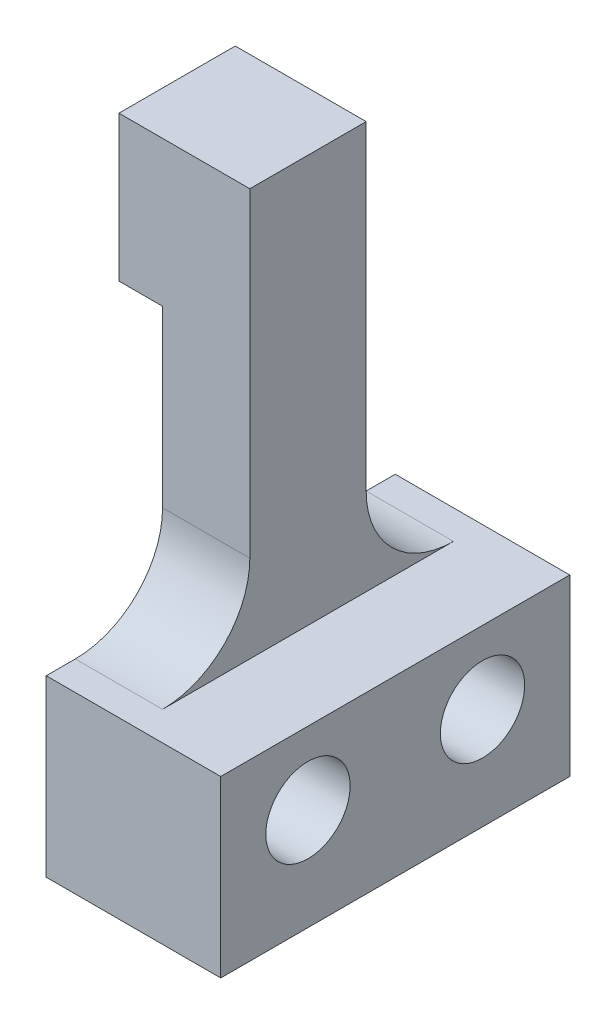
ISO-10303-21;
HEADER;
FILE_DESCRIPTION(('STEP AP214'),'2;1');
FILE_NAME('part.step','',(''),(''),'','','');
FILE_SCHEMA(('AUTOMOTIVE_DESIGN { 1 0 10303 214 1 1 1 1 }'));
ENDSEC;
DATA;
#1=APPLICATION_CONTEXT('core data for automotive mechanical design processes');
#2=APPLICATION_PROTOCOL_DEFINITION('international standard','automotive_design',2000,#1);
#3=PRODUCT_CONTEXT('',#1,'mechanical');
#4=PRODUCT('Part','Part','',(#3));
#5=PRODUCT_RELATED_PRODUCT_CATEGORY('part','',(#4));
#6=PRODUCT_DEFINITION_FORMATION('','',#4);
#7=PRODUCT_DEFINITION_CONTEXT('part definition',#1,'design');
#8=PRODUCT_DEFINITION('design','',#6,#7);
#9=PRODUCT_DEFINITION_SHAPE('','',#8);
#10=(LENGTH_UNIT() NAMED_UNIT(*) SI_UNIT(.MILLI.,.METRE.));
#11=(NAMED_UNIT(*) PLANE_ANGLE_UNIT() SI_UNIT($,.RADIAN.));
#12=(NAMED_UNIT(*) SI_UNIT($,.STERADIAN.) SOLID_ANGLE_UNIT());
#13=UNCERTAINTY_MEASURE_WITH_UNIT(LENGTH_MEASURE(1.E-05),#10,'distance_accuracy_value','');
#14=(GEOMETRIC_REPRESENTATION_CONTEXT(3) GLOBAL_UNCERTAINTY_ASSIGNED_CONTEXT((#13)) GLOBAL_UNIT_ASSIGNED_CONTEXT((#10,
#11,#12)) REPRESENTATION_CONTEXT('',''));
#15=CARTESIAN_POINT('',(0.,0.,0.));
#16=DIRECTION('',(0.,0.,1.));
#17=DIRECTION('',(1.,0.,0.));
#18=AXIS2_PLACEMENT_3D('',#15,#16,#17);
#19=CARTESIAN_POINT('',(0.,-0.868421052631572,12.));
#20=DIRECTION('',(-1.,0.,0.));
#21=DIRECTION('',(0.,-1.,0.));
#22=AXIS2_PLACEMENT_3D('',#19,#20,#21);
#23=PLANE('',#22);
#24=CARTESIAN_POINT('',(0.,-3.36842105263157,3.));
#25=DIRECTION('',(-1.,0.,0.));
#26=DIRECTION('',(0.,0.,1.));
#27=AXIS2_PLACEMENT_3D('',#24,#25,#26);
#28=CIRCLE('',#27,1.45);
#29=CARTESIAN_POINT('',(0.,-3.36842105263157,4.45));
#30=VERTEX_POINT('',#29);
#31=EDGE_CURVE('E291',#30,#30,#28,.T.);
#32=ORIENTED_EDGE('',*,*,#31,.T.);
#33=EDGE_LOOP('',(#32));
#34=FACE_BOUND('',#33,.T.);
#35=CARTESIAN_POINT('',(0.,-3.36842105263157,9.));
#36=DIRECTION('',(-1.,0.,0.));
#37=DIRECTION('',(0.,0.,1.));
#38=AXIS2_PLACEMENT_3D('',#35,#36,#37);
#39=CIRCLE('',#38,1.45);
#40=CARTESIAN_POINT('',(0.,-3.36842105263157,10.45));
#41=VERTEX_POINT('',#40);
#42=EDGE_CURVE('E134',#41,#41,#39,.T.);
#43=ORIENTED_EDGE('',*,*,#42,.T.);
#44=EDGE_LOOP('',(#43));
#45=FACE_BOUND('',#44,.T.);
#46=DIRECTION('',(0.,1.,0.));
#47=VECTOR('',#46,1.);
#48=CARTESIAN_POINT('',(0.,-0.868421052631572,0.));
#49=LINE('',#48,#47);
#50=CARTESIAN_POINT('',(0.,-6.86842105263157,0.));
#51=VERTEX_POINT('',#50);
#52=CARTESIAN_POINT('',(0.,-0.868421052631572,0.));
#53=VERTEX_POINT('',#52);
#54=EDGE_CURVE('E200',#51,#53,#49,.T.);
#55=ORIENTED_EDGE('',*,*,#54,.T.);
#56=DIRECTION('',(0.,0.,-1.));
#57=VECTOR('',#56,1.);
#58=CARTESIAN_POINT('',(0.,-0.868421052631572,12.));
#59=LINE('',#58,#57);
#60=CARTESIAN_POINT('',(0.,-0.868421052631572,12.));
#61=VERTEX_POINT('',#60);
#62=EDGE_CURVE('E142',#61,#53,#59,.T.);
#63=ORIENTED_EDGE('',*,*,#62,.F.);
#64=DIRECTION('',(0.,1.,0.));
#65=VECTOR('',#64,1.);
#66=CARTESIAN_POINT('',(0.,-0.868421052631572,12.));
#67=LINE('',#66,#65);
#68=CARTESIAN_POINT('',(0.,-6.86842105263157,12.));
#69=VERTEX_POINT('',#68);
#70=EDGE_CURVE('E201',#69,#61,#67,.T.);
#71=ORIENTED_EDGE('',*,*,#70,.F.);
#72=DIRECTION('',(0.,0.,-1.));
#73=VECTOR('',#72,1.);
#74=CARTESIAN_POINT('',(0.,-6.86842105263157,12.));
#75=LINE('',#74,#73);
#76=EDGE_CURVE('E211',#69,#51,#75,.T.);
#77=ORIENTED_EDGE('',*,*,#76,.T.);
#78=EDGE_LOOP('',(#55,#63,#71,#77));
#79=FACE_BOUND('',#78,.T.);
#80=ADVANCED_FACE('F32',(#34,#45,#79),#23,.F.);
#81=CARTESIAN_POINT('',(-3.,-0.868421052631572,12.));
#82=DIRECTION('',(0.,-1.,0.));
#83=DIRECTION('',(0.,0.,-1.));
#84=AXIS2_PLACEMENT_3D('',#81,#82,#83);
#85=PLANE('',#84);
#86=DIRECTION('',(0.,0.,-1.));
#87=VECTOR('',#86,1.);
#88=CARTESIAN_POINT('',(-3.,-0.868421052631572,12.));
#89=LINE('',#88,#87);
#90=CARTESIAN_POINT('',(-3.,-0.868421052631572,11.));
#91=VERTEX_POINT('',#90);
#92=CARTESIAN_POINT('',(-3.,-0.868421052631572,0.999999999999999));
#93=VERTEX_POINT('',#92);
#94=EDGE_CURVE('E139',#91,#93,#89,.T.);
#95=ORIENTED_EDGE('',*,*,#94,.F.);
#96=DIRECTION('',(1.,0.,0.));
#97=VECTOR('',#96,1.);
#98=CARTESIAN_POINT('',(-6.,-0.868421052631572,11.));
#99=LINE('',#98,#97);
#100=CARTESIAN_POINT('',(-6.,-0.868421052631573,11.));
#101=VERTEX_POINT('',#100);
#102=EDGE_CURVE('E160',#91,#101,#99,.F.);
#103=ORIENTED_EDGE('',*,*,#102,.T.);
#104=DIRECTION('',(0.,0.,-1.));
#105=VECTOR('',#104,1.);
#106=CARTESIAN_POINT('',(-6.,-0.868421052631573,12.));
#107=LINE('',#106,#105);
#108=CARTESIAN_POINT('',(-6.,-0.868421052631572,12.));
#109=VERTEX_POINT('',#108);
#110=EDGE_CURVE('E176',#109,#101,#107,.T.);
#111=ORIENTED_EDGE('',*,*,#110,.F.);
#112=DIRECTION('',(-1.,0.,0.));
#113=VECTOR('',#112,1.);
#114=CARTESIAN_POINT('',(-3.,-0.868421052631572,12.));
#115=LINE('',#114,#113);
#116=EDGE_CURVE('E204',#61,#109,#115,.T.);
#117=ORIENTED_EDGE('',*,*,#116,.F.);
#118=ORIENTED_EDGE('',*,*,#62,.T.);
#119=DIRECTION('',(-1.,0.,0.));
#120=VECTOR('',#119,1.);
#121=CARTESIAN_POINT('',(-3.,-0.868421052631572,0.));
#122=LINE('',#121,#120);
#123=CARTESIAN_POINT('',(-6.,-0.868421052631572,0.));
#124=VERTEX_POINT('',#123);
#125=EDGE_CURVE('E214',#53,#124,#122,.T.);
#126=ORIENTED_EDGE('',*,*,#125,.T.);
#127=DIRECTION('',(0.,0.,-1.));
#128=VECTOR('',#127,1.);
#129=CARTESIAN_POINT('',(-6.,-0.868421052631572,12.));
#130=LINE('',#129,#128);
#131=CARTESIAN_POINT('',(-6.,-0.868421052631572,0.999999999999999));
#132=VERTEX_POINT('',#131);
#133=EDGE_CURVE('E189',#132,#124,#130,.T.);
#134=ORIENTED_EDGE('',*,*,#133,.F.);
#135=DIRECTION('',(1.,0.,0.));
#136=VECTOR('',#135,1.);
#137=CARTESIAN_POINT('',(-3.,-0.868421052631572,0.999999999999999));
#138=LINE('',#137,#136);
#139=EDGE_CURVE('E157',#132,#93,#138,.T.);
#140=ORIENTED_EDGE('',*,*,#139,.T.);
#141=EDGE_LOOP('',(#95,#103,#111,#117,#118,#126,#134,#140));
#142=FACE_BOUND('',#141,.T.);
#143=ADVANCED_FACE('F241',(#142),#85,.F.);
#144=CARTESIAN_POINT('',(-3.,13.1315789473684,12.));
#145=DIRECTION('',(-1.,0.,0.));
#146=DIRECTION('',(0.,-1.,0.));
#147=AXIS2_PLACEMENT_3D('',#144,#145,#146);
#148=PLANE('',#147);
#149=DIRECTION('',(0.,0.,-1.));
#150=VECTOR('',#149,1.);
#151=CARTESIAN_POINT('',(-3.,13.1315789473684,12.));
#152=LINE('',#151,#150);
#153=CARTESIAN_POINT('',(-3.,13.1315789473684,8.));
#154=VERTEX_POINT('',#153);
#155=CARTESIAN_POINT('',(-3.,13.1315789473684,4.));
#156=VERTEX_POINT('',#155);
#157=EDGE_CURVE('E133',#154,#156,#152,.T.);
#158=ORIENTED_EDGE('',*,*,#157,.F.);
#159=DIRECTION('',(0.,1.,0.));
#160=VECTOR('',#159,1.);
#161=CARTESIAN_POINT('',(-3.,14.2111515597634,8.));
#162=LINE('',#161,#160);
#163=CARTESIAN_POINT('',(-3.,2.13157894736843,8.));
#164=VERTEX_POINT('',#163);
#165=EDGE_CURVE('E185',#164,#154,#162,.T.);
#166=ORIENTED_EDGE('',*,*,#165,.F.);
#167=CARTESIAN_POINT('',(-3.,2.13157894736843,11.));
#168=DIRECTION('',(-1.,0.,0.));
#169=DIRECTION('',(0.,-1.,0.));
#170=AXIS2_PLACEMENT_3D('',#167,#168,#169);
#171=CIRCLE('',#170,3.);
#172=EDGE_CURVE('E163',#164,#91,#171,.T.);
#173=ORIENTED_EDGE('',*,*,#172,.T.);
#174=ORIENTED_EDGE('',*,*,#94,.T.);
#175=CARTESIAN_POINT('',(-3.,2.13157894736843,0.999999999999999));
#176=DIRECTION('',(-1.,0.,0.));
#177=DIRECTION('',(0.,-1.,0.));
#178=AXIS2_PLACEMENT_3D('',#175,#176,#177);
#179=CIRCLE('',#178,3.);
#180=CARTESIAN_POINT('',(-3.,2.13157894736843,4.));
#181=VERTEX_POINT('',#180);
#182=EDGE_CURVE('E40',#93,#181,#179,.T.);
#183=ORIENTED_EDGE('',*,*,#182,.T.);
#184=DIRECTION('',(0.,-1.,0.));
#185=VECTOR('',#184,1.);
#186=CARTESIAN_POINT('',(-3.,14.2111515597634,4.));
#187=LINE('',#186,#185);
#188=EDGE_CURVE('E120',#156,#181,#187,.T.);
#189=ORIENTED_EDGE('',*,*,#188,.F.);
#190=EDGE_LOOP('',(#158,#166,#173,#174,#183,#189));
#191=FACE_BOUND('',#190,.T.);
#192=ADVANCED_FACE('F131',(#191),#148,.F.);
#193=CARTESIAN_POINT('',(-7.5,13.1315789473684,12.));
#194=DIRECTION('',(0.,-1.,0.));
#195=DIRECTION('',(0.,0.,-1.));
#196=AXIS2_PLACEMENT_3D('',#193,#194,#195);
#197=PLANE('',#196);
#198=DIRECTION('',(0.,0.,-1.));
#199=VECTOR('',#198,1.);
#200=CARTESIAN_POINT('',(-7.5,13.1315789473684,12.));
#201=LINE('',#200,#199);
#202=CARTESIAN_POINT('',(-7.5,13.1315789473684,8.));
#203=VERTEX_POINT('',#202);
#204=CARTESIAN_POINT('',(-7.5,13.1315789473684,4.));
#205=VERTEX_POINT('',#204);
#206=EDGE_CURVE('E140',#203,#205,#201,.T.);
#207=ORIENTED_EDGE('',*,*,#206,.F.);
#208=DIRECTION('',(1.,0.,0.));
#209=VECTOR('',#208,1.);
#210=CARTESIAN_POINT('',(-7.5,13.1315789473684,8.));
#211=LINE('',#210,#209);
#212=EDGE_CURVE('E138',#203,#154,#211,.T.);
#213=ORIENTED_EDGE('',*,*,#212,.T.);
#214=ORIENTED_EDGE('',*,*,#157,.T.);
#215=DIRECTION('',(-1.,0.,0.));
#216=VECTOR('',#215,1.);
#217=CARTESIAN_POINT('',(-7.5,13.1315789473684,4.));
#218=LINE('',#217,#216);
#219=EDGE_CURVE('E118',#156,#205,#218,.T.);
#220=ORIENTED_EDGE('',*,*,#219,.T.);
#221=EDGE_LOOP('',(#207,#213,#214,#220));
#222=FACE_BOUND('',#221,.T.);
#223=ADVANCED_FACE('F137',(#222),#197,.F.);
#224=CARTESIAN_POINT('',(-7.5,8.13157894736843,12.));
#225=DIRECTION('',(1.,0.,0.));
#226=DIRECTION('',(0.,0.,-1.));
#227=AXIS2_PLACEMENT_3D('',#224,#225,#226);
#228=PLANE('',#227);
#229=DIRECTION('',(0.,0.,-1.));
#230=VECTOR('',#229,1.);
#231=CARTESIAN_POINT('',(-7.5,8.13157894736843,12.));
#232=LINE('',#231,#230);
#233=CARTESIAN_POINT('',(-7.5,8.13157894736843,8.));
#234=VERTEX_POINT('',#233);
#235=CARTESIAN_POINT('',(-7.5,8.13157894736843,4.));
#236=VERTEX_POINT('',#235);
#237=EDGE_CURVE('E144',#234,#236,#232,.T.);
#238=ORIENTED_EDGE('',*,*,#237,.F.);
#239=DIRECTION('',(0.,1.,0.));
#240=VECTOR('',#239,1.);
#241=CARTESIAN_POINT('',(-7.5,14.2111515597634,8.));
#242=LINE('',#241,#240);
#243=EDGE_CURVE('E186',#234,#203,#242,.T.);
#244=ORIENTED_EDGE('',*,*,#243,.T.);
#245=ORIENTED_EDGE('',*,*,#206,.T.);
#246=DIRECTION('',(0.,-1.,0.));
#247=VECTOR('',#246,1.);
#248=CARTESIAN_POINT('',(-7.5,14.2111515597634,4.));
#249=LINE('',#248,#247);
#250=EDGE_CURVE('E122',#205,#236,#249,.T.);
#251=ORIENTED_EDGE('',*,*,#250,.T.);
#252=EDGE_LOOP('',(#238,#244,#245,#251));
#253=FACE_BOUND('',#252,.T.);
#254=ADVANCED_FACE('F231',(#253),#228,.F.);
#255=CARTESIAN_POINT('',(-6.,8.13157894736843,12.));
#256=DIRECTION('',(0.,1.,0.));
#257=DIRECTION('',(-1.,0.,0.));
#258=AXIS2_PLACEMENT_3D('',#255,#256,#257);
#259=PLANE('',#258);
#260=DIRECTION('',(0.,0.,-1.));
#261=VECTOR('',#260,1.);
#262=CARTESIAN_POINT('',(-6.,8.13157894736843,12.));
#263=LINE('',#262,#261);
#264=CARTESIAN_POINT('',(-6.,8.13157894736843,8.));
#265=VERTEX_POINT('',#264);
#266=CARTESIAN_POINT('',(-6.,8.13157894736843,4.));
#267=VERTEX_POINT('',#266);
#268=EDGE_CURVE('E225',#265,#267,#263,.T.);
#269=ORIENTED_EDGE('',*,*,#268,.F.);
#270=DIRECTION('',(-1.,0.,0.));
#271=VECTOR('',#270,1.);
#272=CARTESIAN_POINT('',(-6.,8.13157894736843,8.));
#273=LINE('',#272,#271);
#274=EDGE_CURVE('E127',#265,#234,#273,.T.);
#275=ORIENTED_EDGE('',*,*,#274,.T.);
#276=ORIENTED_EDGE('',*,*,#237,.T.);
#277=DIRECTION('',(1.,0.,0.));
#278=VECTOR('',#277,1.);
#279=CARTESIAN_POINT('',(-6.,8.13157894736843,4.));
#280=LINE('',#279,#278);
#281=EDGE_CURVE('E128',#236,#267,#280,.T.);
#282=ORIENTED_EDGE('',*,*,#281,.T.);
#283=EDGE_LOOP('',(#269,#275,#276,#282));
#284=FACE_BOUND('',#283,.T.);
#285=ADVANCED_FACE('F229',(#284),#259,.F.);
#286=CARTESIAN_POINT('',(-6.,-6.86842105263157,12.));
#287=DIRECTION('',(1.,0.,0.));
#288=DIRECTION('',(0.,0.,-1.));
#289=AXIS2_PLACEMENT_3D('',#286,#287,#288);
#290=PLANE('',#289);
#291=CARTESIAN_POINT('',(-6.,-3.36842105263157,3.));
#292=DIRECTION('',(-1.,0.,0.));
#293=DIRECTION('',(0.,0.,1.));
#294=AXIS2_PLACEMENT_3D('',#291,#292,#293);
#295=CIRCLE('',#294,1.45);
#296=CARTESIAN_POINT('',(-6.,-3.36842105263157,4.45));
#297=VERTEX_POINT('',#296);
#298=EDGE_CURVE('E286',#297,#297,#295,.T.);
#299=ORIENTED_EDGE('',*,*,#298,.F.);
#300=EDGE_LOOP('',(#299));
#301=FACE_BOUND('',#300,.T.);
#302=CARTESIAN_POINT('',(-6.,-3.36842105263157,9.));
#303=DIRECTION('',(-1.,0.,0.));
#304=DIRECTION('',(0.,0.,1.));
#305=AXIS2_PLACEMENT_3D('',#302,#303,#304);
#306=CIRCLE('',#305,1.45);
#307=CARTESIAN_POINT('',(-6.,-3.36842105263157,10.45));
#308=VERTEX_POINT('',#307);
#309=EDGE_CURVE('E289',#308,#308,#306,.T.);
#310=ORIENTED_EDGE('',*,*,#309,.F.);
#311=EDGE_LOOP('',(#310));
#312=FACE_BOUND('',#311,.T.);
#313=ORIENTED_EDGE('',*,*,#110,.T.);
#314=CARTESIAN_POINT('',(-6.,2.13157894736843,11.));
#315=DIRECTION('',(1.,0.,0.));
#316=DIRECTION('',(0.,0.,-1.));
#317=AXIS2_PLACEMENT_3D('',#314,#315,#316);
#318=CIRCLE('',#317,3.);
#319=CARTESIAN_POINT('',(-6.,2.13157894736843,8.));
#320=VERTEX_POINT('',#319);
#321=EDGE_CURVE('E166',#101,#320,#318,.T.);
#322=ORIENTED_EDGE('',*,*,#321,.T.);
#323=DIRECTION('',(0.,1.,0.));
#324=VECTOR('',#323,1.);
#325=CARTESIAN_POINT('',(-6.,-6.86842105263157,8.));
#326=LINE('',#325,#324);
#327=EDGE_CURVE('E152',#320,#265,#326,.T.);
#328=ORIENTED_EDGE('',*,*,#327,.T.);
#329=ORIENTED_EDGE('',*,*,#268,.T.);
#330=DIRECTION('',(0.,-1.,0.));
#331=VECTOR('',#330,1.);
#332=CARTESIAN_POINT('',(-6.,-6.86842105263157,4.));
#333=LINE('',#332,#331);
#334=CARTESIAN_POINT('',(-6.,2.13157894736843,4.));
#335=VERTEX_POINT('',#334);
#336=EDGE_CURVE('E150',#267,#335,#333,.T.);
#337=ORIENTED_EDGE('',*,*,#336,.T.);
#338=CARTESIAN_POINT('',(-6.,2.13157894736843,0.999999999999999));
#339=DIRECTION('',(1.,0.,0.));
#340=DIRECTION('',(0.,0.,-1.));
#341=AXIS2_PLACEMENT_3D('',#338,#339,#340);
#342=CIRCLE('',#341,3.);
#343=EDGE_CURVE('E11',#335,#132,#342,.T.);
#344=ORIENTED_EDGE('',*,*,#343,.T.);
#345=ORIENTED_EDGE('',*,*,#133,.T.);
#346=DIRECTION('',(0.,-1.,0.));
#347=VECTOR('',#346,1.);
#348=CARTESIAN_POINT('',(-6.,-6.86842105263157,0.));
#349=LINE('',#348,#347);
#350=CARTESIAN_POINT('',(-6.,-6.86842105263157,0.));
#351=VERTEX_POINT('',#350);
#352=EDGE_CURVE('E217',#124,#351,#349,.T.);
#353=ORIENTED_EDGE('',*,*,#352,.T.);
#354=DIRECTION('',(0.,0.,-1.));
#355=VECTOR('',#354,1.);
#356=CARTESIAN_POINT('',(-6.,-6.86842105263157,12.));
#357=LINE('',#356,#355);
#358=CARTESIAN_POINT('',(-6.,-6.86842105263157,12.));
#359=VERTEX_POINT('',#358);
#360=EDGE_CURVE('E222',#359,#351,#357,.T.);
#361=ORIENTED_EDGE('',*,*,#360,.F.);
#362=DIRECTION('',(0.,-1.,0.));
#363=VECTOR('',#362,1.);
#364=CARTESIAN_POINT('',(-6.,-6.86842105263157,12.));
#365=LINE('',#364,#363);
#366=EDGE_CURVE('E207',#109,#359,#365,.T.);
#367=ORIENTED_EDGE('',*,*,#366,.F.);
#368=EDGE_LOOP('',(#313,#322,#328,#329,#337,#344,#345,#353,#361,#367));
#369=FACE_BOUND('',#368,.T.);
#370=ADVANCED_FACE('F171',(#301,#312,#369),#290,.F.);
#371=CARTESIAN_POINT('',(0.,-6.86842105263157,12.));
#372=DIRECTION('',(0.,1.,0.));
#373=DIRECTION('',(-1.,0.,0.));
#374=AXIS2_PLACEMENT_3D('',#371,#372,#373);
#375=PLANE('',#374);
#376=DIRECTION('',(1.,0.,0.));
#377=VECTOR('',#376,1.);
#378=CARTESIAN_POINT('',(0.,-6.86842105263157,0.));
#379=LINE('',#378,#377);
#380=EDGE_CURVE('E205',#351,#51,#379,.T.);
#381=ORIENTED_EDGE('',*,*,#380,.T.);
#382=ORIENTED_EDGE('',*,*,#76,.F.);
#383=DIRECTION('',(1.,0.,0.));
#384=VECTOR('',#383,1.);
#385=CARTESIAN_POINT('',(0.,-6.86842105263157,12.));
#386=LINE('',#385,#384);
#387=EDGE_CURVE('E209',#359,#69,#386,.T.);
#388=ORIENTED_EDGE('',*,*,#387,.F.);
#389=ORIENTED_EDGE('',*,*,#360,.T.);
#390=EDGE_LOOP('',(#381,#382,#388,#389));
#391=FACE_BOUND('',#390,.T.);
#392=ADVANCED_FACE('F271',(#391),#375,.F.);
#393=CARTESIAN_POINT('',(0.,0.,12.));
#394=DIRECTION('',(0.,0.,-1.));
#395=DIRECTION('',(-1.,0.,0.));
#396=AXIS2_PLACEMENT_3D('',#393,#394,#395);
#397=PLANE('',#396);
#398=ORIENTED_EDGE('',*,*,#116,.T.);
#399=ORIENTED_EDGE('',*,*,#366,.T.);
#400=ORIENTED_EDGE('',*,*,#387,.T.);
#401=ORIENTED_EDGE('',*,*,#70,.T.);
#402=EDGE_LOOP('',(#398,#399,#400,#401));
#403=FACE_BOUND('',#402,.T.);
#404=ADVANCED_FACE('F268',(#403),#397,.F.);
#405=CARTESIAN_POINT('',(0.,0.,0.));
#406=DIRECTION('',(0.,0.,-1.));
#407=DIRECTION('',(-1.,0.,0.));
#408=AXIS2_PLACEMENT_3D('',#405,#406,#407);
#409=PLANE('',#408);
#410=ORIENTED_EDGE('',*,*,#352,.F.);
#411=ORIENTED_EDGE('',*,*,#125,.F.);
#412=ORIENTED_EDGE('',*,*,#54,.F.);
#413=ORIENTED_EDGE('',*,*,#380,.F.);
#414=EDGE_LOOP('',(#410,#411,#412,#413));
#415=FACE_BOUND('',#414,.T.);
#416=ADVANCED_FACE('F263',(#415),#409,.T.);
#417=CARTESIAN_POINT('',(-7.5,14.2111515597634,4.));
#418=DIRECTION('',(0.,0.,1.));
#419=DIRECTION('',(0.,-1.,0.));
#420=AXIS2_PLACEMENT_3D('',#417,#418,#419);
#421=PLANE('',#420);
#422=ORIENTED_EDGE('',*,*,#188,.T.);
#423=DIRECTION('',(1.,0.,0.));
#424=VECTOR('',#423,1.);
#425=CARTESIAN_POINT('',(-6.,2.13157894736843,4.));
#426=LINE('',#425,#424);
#427=EDGE_CURVE('E47',#181,#335,#426,.F.);
#428=ORIENTED_EDGE('',*,*,#427,.T.);
#429=ORIENTED_EDGE('',*,*,#336,.F.);
#430=ORIENTED_EDGE('',*,*,#281,.F.);
#431=ORIENTED_EDGE('',*,*,#250,.F.);
#432=ORIENTED_EDGE('',*,*,#219,.F.);
#433=EDGE_LOOP('',(#422,#428,#429,#430,#431,#432));
#434=FACE_BOUND('',#433,.T.);
#435=ADVANCED_FACE('F119',(#434),#421,.F.);
#436=CARTESIAN_POINT('',(-7.5,14.2111515597634,8.));
#437=DIRECTION('',(0.,0.,-1.));
#438=DIRECTION('',(0.,1.,0.));
#439=AXIS2_PLACEMENT_3D('',#436,#437,#438);
#440=PLANE('',#439);
#441=ORIENTED_EDGE('',*,*,#327,.F.);
#442=DIRECTION('',(1.,0.,0.));
#443=VECTOR('',#442,1.);
#444=CARTESIAN_POINT('',(-3.,2.13157894736843,8.));
#445=LINE('',#444,#443);
#446=EDGE_CURVE('E154',#320,#164,#445,.T.);
#447=ORIENTED_EDGE('',*,*,#446,.T.);
#448=ORIENTED_EDGE('',*,*,#165,.T.);
#449=ORIENTED_EDGE('',*,*,#212,.F.);
#450=ORIENTED_EDGE('',*,*,#243,.F.);
#451=ORIENTED_EDGE('',*,*,#274,.F.);
#452=EDGE_LOOP('',(#441,#447,#448,#449,#450,#451));
#453=FACE_BOUND('',#452,.T.);
#454=ADVANCED_FACE('F181',(#453),#440,.F.);
#455=CARTESIAN_POINT('',(-7.5,2.13157894736843,11.));
#456=DIRECTION('',(-1.,0.,0.));
#457=DIRECTION('',(0.,0.,1.));
#458=AXIS2_PLACEMENT_3D('',#455,#456,#457);
#459=CYLINDRICAL_SURFACE('',#458,3.);
#460=ORIENTED_EDGE('',*,*,#321,.F.);
#461=ORIENTED_EDGE('',*,*,#102,.F.);
#462=ORIENTED_EDGE('',*,*,#172,.F.);
#463=ORIENTED_EDGE('',*,*,#446,.F.);
#464=EDGE_LOOP('',(#460,#461,#462,#463));
#465=FACE_BOUND('',#464,.T.);
#466=ADVANCED_FACE('F184',(#465),#459,.F.);
#467=CARTESIAN_POINT('',(-3.,2.13157894736843,0.999999999999999));
#468=DIRECTION('',(-1.,0.,0.));
#469=DIRECTION('',(0.,0.,1.));
#470=AXIS2_PLACEMENT_3D('',#467,#468,#469);
#471=CYLINDRICAL_SURFACE('',#470,3.);
#472=ORIENTED_EDGE('',*,*,#343,.F.);
#473=ORIENTED_EDGE('',*,*,#427,.F.);
#474=ORIENTED_EDGE('',*,*,#182,.F.);
#475=ORIENTED_EDGE('',*,*,#139,.F.);
#476=EDGE_LOOP('',(#472,#473,#474,#475));
#477=FACE_BOUND('',#476,.T.);
#478=ADVANCED_FACE('F34',(#477),#471,.F.);
#479=CARTESIAN_POINT('',(-6.,-3.36842105263157,9.));
#480=DIRECTION('',(-1.,0.,0.));
#481=DIRECTION('',(0.,0.,1.));
#482=AXIS2_PLACEMENT_3D('',#479,#480,#481);
#483=CYLINDRICAL_SURFACE('',#482,1.45);
#484=ORIENTED_EDGE('',*,*,#42,.F.);
#485=EDGE_LOOP('',(#484));
#486=FACE_BOUND('',#485,.T.);
#487=ORIENTED_EDGE('',*,*,#309,.T.);
#488=EDGE_LOOP('',(#487));
#489=FACE_BOUND('',#488,.T.);
#490=ADVANCED_FACE('F257',(#486,#489),#483,.F.);
#491=CARTESIAN_POINT('',(-6.,-3.36842105263157,3.));
#492=DIRECTION('',(-1.,0.,0.));
#493=DIRECTION('',(0.,0.,1.));
#494=AXIS2_PLACEMENT_3D('',#491,#492,#493);
#495=CYLINDRICAL_SURFACE('',#494,1.45);
#496=ORIENTED_EDGE('',*,*,#31,.F.);
#497=EDGE_LOOP('',(#496));
#498=FACE_BOUND('',#497,.T.);
#499=ORIENTED_EDGE('',*,*,#298,.T.);
#500=EDGE_LOOP('',(#499));
#501=FACE_BOUND('',#500,.T.);
#502=ADVANCED_FACE('F297',(#498,#501),#495,.F.);
#503=CLOSED_SHELL('',(#80,#143,#192,#223,#254,#285,#370,#392,#404,#416,#435,#454,#466,#478,#490,#502));
#504=MANIFOLD_SOLID_BREP('B2',#503);
#505=ADVANCED_BREP_SHAPE_REPRESENTATION('',(#18,#504),#14);
#506=SHAPE_DEFINITION_REPRESENTATION(#9,#505);
ENDSEC;
END-ISO-10303-21;
